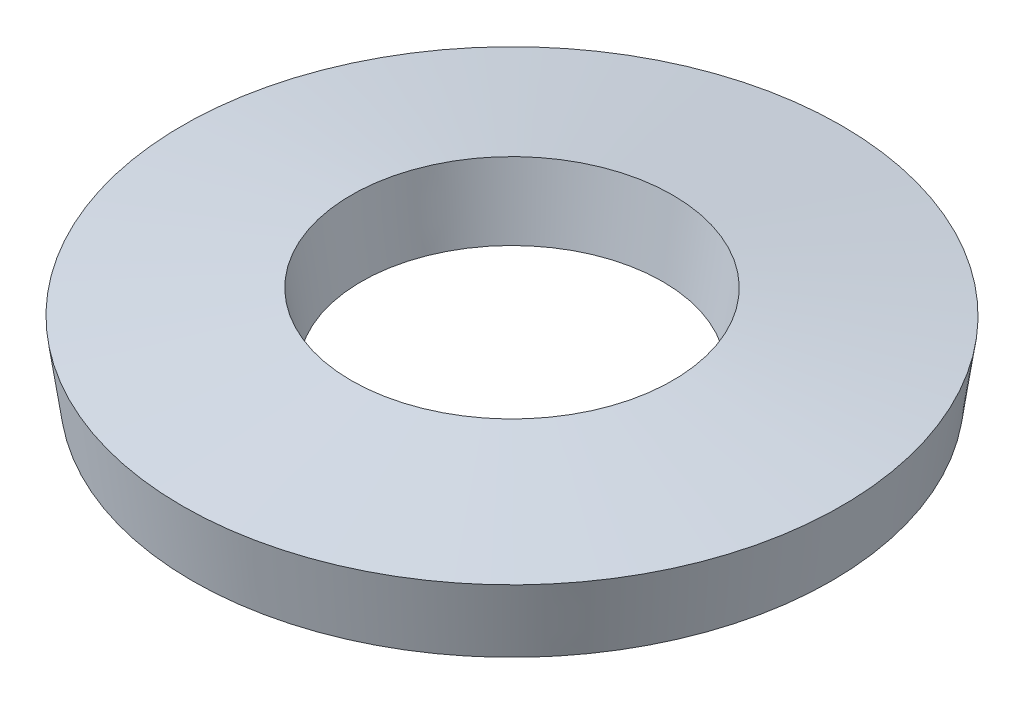
ISO-10303-21;
HEADER;
FILE_DESCRIPTION(('STEP AP214'),'2;1');
FILE_NAME('part.step','',(''),(''),'','','');
FILE_SCHEMA(('AUTOMOTIVE_DESIGN { 1 0 10303 214 1 1 1 1 }'));
ENDSEC;
DATA;
#1=APPLICATION_CONTEXT('core data for automotive mechanical design processes');
#2=APPLICATION_PROTOCOL_DEFINITION('international standard','automotive_design',2000,#1);
#3=PRODUCT_CONTEXT('',#1,'mechanical');
#4=PRODUCT('Part','Part','',(#3));
#5=PRODUCT_RELATED_PRODUCT_CATEGORY('part','',(#4));
#6=PRODUCT_DEFINITION_FORMATION('','',#4);
#7=PRODUCT_DEFINITION_CONTEXT('part definition',#1,'design');
#8=PRODUCT_DEFINITION('design','',#6,#7);
#9=PRODUCT_DEFINITION_SHAPE('','',#8);
#10=(LENGTH_UNIT() NAMED_UNIT(*) SI_UNIT(.MILLI.,.METRE.));
#11=(NAMED_UNIT(*) PLANE_ANGLE_UNIT() SI_UNIT($,.RADIAN.));
#12=(NAMED_UNIT(*) SI_UNIT($,.STERADIAN.) SOLID_ANGLE_UNIT());
#13=UNCERTAINTY_MEASURE_WITH_UNIT(LENGTH_MEASURE(1.E-05),#10,'distance_accuracy_value','');
#14=(GEOMETRIC_REPRESENTATION_CONTEXT(3) GLOBAL_UNCERTAINTY_ASSIGNED_CONTEXT((#13)) GLOBAL_UNIT_ASSIGNED_CONTEXT((#10,
#11,#12)) REPRESENTATION_CONTEXT('',''));
#15=CARTESIAN_POINT('',(0.,0.,0.));
#16=DIRECTION('',(0.,0.,1.));
#17=DIRECTION('',(1.,0.,0.));
#18=AXIS2_PLACEMENT_3D('',#15,#16,#17);
#19=CARTESIAN_POINT('',(0.,0.,0.));
#20=DIRECTION('',(0.,1.,0.));
#21=DIRECTION('',(0.,0.,1.));
#22=AXIS2_PLACEMENT_3D('',#19,#20,#21);
#23=CONICAL_SURFACE('',#22,6.786710012267,0.142676904490484);
#24=CARTESIAN_POINT('',(0.,1.48475835782556,0.));
#25=DIRECTION('',(0.,-1.,0.));
#26=DIRECTION('',(0.,0.,-1.));
#27=AXIS2_PLACEMENT_3D('',#24,#25,#26);
#28=CIRCLE('',#27,7.);
#29=CARTESIAN_POINT('',(0.,1.48475835782556,-7.));
#30=VERTEX_POINT('',#29);
#31=EDGE_CURVE('E52',#30,#30,#28,.T.);
#32=ORIENTED_EDGE('',*,*,#31,.T.);
#33=EDGE_LOOP('',(#32));
#34=FACE_BOUND('',#33,.T.);
#35=CARTESIAN_POINT('',(0.,0.,0.));
#36=DIRECTION('',(0.,-1.,0.));
#37=DIRECTION('',(0.,0.,-1.));
#38=AXIS2_PLACEMENT_3D('',#35,#36,#37);
#39=CIRCLE('',#38,6.786710012267);
#40=CARTESIAN_POINT('',(0.,0.,-6.786710012267));
#41=VERTEX_POINT('',#40);
#42=EDGE_CURVE('E10',#41,#41,#39,.T.);
#43=ORIENTED_EDGE('',*,*,#42,.F.);
#44=EDGE_LOOP('',(#43));
#45=FACE_BOUND('',#44,.T.);
#46=ADVANCED_FACE('F38',(#34,#45),#23,.T.);
#47=CARTESIAN_POINT('',(0.,0.515241642174437,0.));
#48=DIRECTION('',(0.,-1.,0.));
#49=DIRECTION('',(0.,0.,-1.));
#50=AXIS2_PLACEMENT_3D('',#47,#48,#49);
#51=CONICAL_SURFACE('',#50,3.2,1.42811942230441);
#52=ORIENTED_EDGE('',*,*,#42,.T.);
#53=EDGE_LOOP('',(#52));
#54=FACE_BOUND('',#53,.T.);
#55=CARTESIAN_POINT('',(0.,0.515241642174437,0.));
#56=DIRECTION('',(0.,-1.,0.));
#57=DIRECTION('',(0.,0.,-1.));
#58=AXIS2_PLACEMENT_3D('',#55,#56,#57);
#59=CIRCLE('',#58,3.2);
#60=CARTESIAN_POINT('',(0.,0.515241642174437,-3.2));
#61=VERTEX_POINT('',#60);
#62=EDGE_CURVE('E44',#61,#61,#59,.T.);
#63=ORIENTED_EDGE('',*,*,#62,.F.);
#64=EDGE_LOOP('',(#63));
#65=FACE_BOUND('',#64,.T.);
#66=ADVANCED_FACE('F68',(#54,#65),#51,.F.);
#67=CARTESIAN_POINT('',(0.,2.,0.));
#68=DIRECTION('',(0.,1.,0.));
#69=DIRECTION('',(0.,0.,1.));
#70=AXIS2_PLACEMENT_3D('',#67,#68,#69);
#71=CONICAL_SURFACE('',#70,3.413289987733,0.142676904490484);
#72=ORIENTED_EDGE('',*,*,#62,.T.);
#73=EDGE_LOOP('',(#72));
#74=FACE_BOUND('',#73,.T.);
#75=CARTESIAN_POINT('',(0.,2.,0.));
#76=DIRECTION('',(0.,-1.,0.));
#77=DIRECTION('',(0.,0.,-1.));
#78=AXIS2_PLACEMENT_3D('',#75,#76,#77);
#79=CIRCLE('',#78,3.413289987733);
#80=CARTESIAN_POINT('',(0.,2.,-3.413289987733));
#81=VERTEX_POINT('',#80);
#82=EDGE_CURVE('E48',#81,#81,#79,.T.);
#83=ORIENTED_EDGE('',*,*,#82,.F.);
#84=EDGE_LOOP('',(#83));
#85=FACE_BOUND('',#84,.T.);
#86=ADVANCED_FACE('F62',(#74,#85),#71,.F.);
#87=CARTESIAN_POINT('',(0.,1.48475835782556,0.));
#88=DIRECTION('',(0.,-1.,0.));
#89=DIRECTION('',(0.,0.,-1.));
#90=AXIS2_PLACEMENT_3D('',#87,#88,#89);
#91=CONICAL_SURFACE('',#90,7.,1.42811942230441);
#92=ORIENTED_EDGE('',*,*,#82,.T.);
#93=EDGE_LOOP('',(#92));
#94=FACE_BOUND('',#93,.T.);
#95=ORIENTED_EDGE('',*,*,#31,.F.);
#96=EDGE_LOOP('',(#95));
#97=FACE_BOUND('',#96,.T.);
#98=ADVANCED_FACE('F60',(#94,#97),#91,.T.);
#99=CLOSED_SHELL('',(#46,#66,#86,#98));
#100=MANIFOLD_SOLID_BREP('B2',#99);
#101=ADVANCED_BREP_SHAPE_REPRESENTATION('',(#18,#100),#14);
#102=SHAPE_DEFINITION_REPRESENTATION(#9,#101);
ENDSEC;
END-ISO-10303-21;
